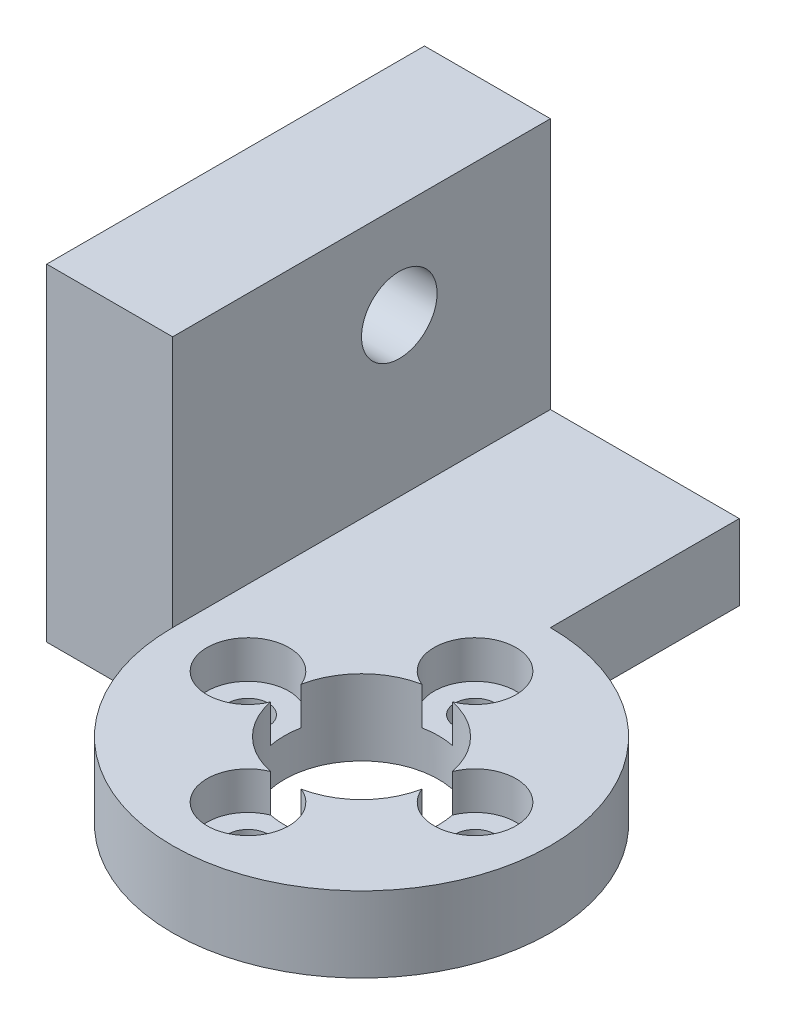
ISO-10303-21;
HEADER;
FILE_DESCRIPTION(('STEP AP214'),'2;1');
FILE_NAME('part.step','',(''),(''),'','','');
FILE_SCHEMA(('AUTOMOTIVE_DESIGN { 1 0 10303 214 1 1 1 1 }'));
ENDSEC;
DATA;
#1=APPLICATION_CONTEXT('core data for automotive mechanical design processes');
#2=APPLICATION_PROTOCOL_DEFINITION('international standard','automotive_design',2000,#1);
#3=PRODUCT_CONTEXT('',#1,'mechanical');
#4=PRODUCT('Part','Part','',(#3));
#5=PRODUCT_RELATED_PRODUCT_CATEGORY('part','',(#4));
#6=PRODUCT_DEFINITION_FORMATION('','',#4);
#7=PRODUCT_DEFINITION_CONTEXT('part definition',#1,'design');
#8=PRODUCT_DEFINITION('design','',#6,#7);
#9=PRODUCT_DEFINITION_SHAPE('','',#8);
#10=(LENGTH_UNIT() NAMED_UNIT(*) SI_UNIT(.MILLI.,.METRE.));
#11=(NAMED_UNIT(*) PLANE_ANGLE_UNIT() SI_UNIT($,.RADIAN.));
#12=(NAMED_UNIT(*) SI_UNIT($,.STERADIAN.) SOLID_ANGLE_UNIT());
#13=UNCERTAINTY_MEASURE_WITH_UNIT(LENGTH_MEASURE(1.E-05),#10,'distance_accuracy_value','');
#14=(GEOMETRIC_REPRESENTATION_CONTEXT(3) GLOBAL_UNCERTAINTY_ASSIGNED_CONTEXT((#13)) GLOBAL_UNIT_ASSIGNED_CONTEXT((#10,
#11,#12)) REPRESENTATION_CONTEXT('',''));
#15=CARTESIAN_POINT('',(0.,0.,0.));
#16=DIRECTION('',(0.,0.,1.));
#17=DIRECTION('',(1.,0.,0.));
#18=AXIS2_PLACEMENT_3D('',#15,#16,#17);
#19=CARTESIAN_POINT('',(0.,6.,0.));
#20=DIRECTION('',(0.,-1.,0.));
#21=DIRECTION('',(0.,0.,-1.));
#22=AXIS2_PLACEMENT_3D('',#19,#20,#21);
#23=CYLINDRICAL_SURFACE('',#22,15.);
#24=DIRECTION('',(0.,-1.,0.));
#25=VECTOR('',#24,1.);
#26=CARTESIAN_POINT('',(-15.,26.,0.));
#27=LINE('',#26,#25);
#28=CARTESIAN_POINT('',(-15.,6.,0.));
#29=VERTEX_POINT('',#28);
#30=CARTESIAN_POINT('',(-15.,0.,0.));
#31=VERTEX_POINT('',#30);
#32=EDGE_CURVE('E194',#29,#31,#27,.T.);
#33=ORIENTED_EDGE('',*,*,#32,.T.);
#34=CARTESIAN_POINT('',(0.,0.,0.));
#35=DIRECTION('',(0.,1.,0.));
#36=DIRECTION('',(0.,0.,1.));
#37=AXIS2_PLACEMENT_3D('',#34,#35,#36);
#38=CIRCLE('',#37,15.);
#39=CARTESIAN_POINT('',(0.,0.,-15.));
#40=VERTEX_POINT('',#39);
#41=EDGE_CURVE('E49',#31,#40,#38,.T.);
#42=ORIENTED_EDGE('',*,*,#41,.T.);
#43=DIRECTION('',(0.,-1.,0.));
#44=VECTOR('',#43,1.);
#45=CARTESIAN_POINT('',(0.,26.,-15.));
#46=LINE('',#45,#44);
#47=CARTESIAN_POINT('',(0.,6.,-15.));
#48=VERTEX_POINT('',#47);
#49=EDGE_CURVE('E192',#48,#40,#46,.T.);
#50=ORIENTED_EDGE('',*,*,#49,.F.);
#51=CARTESIAN_POINT('',(0.,6.,0.));
#52=DIRECTION('',(0.,1.,0.));
#53=DIRECTION('',(0.,0.,1.));
#54=AXIS2_PLACEMENT_3D('',#51,#52,#53);
#55=CIRCLE('',#54,15.);
#56=EDGE_CURVE('E246',#29,#48,#55,.T.);
#57=ORIENTED_EDGE('',*,*,#56,.F.);
#58=EDGE_LOOP('',(#33,#42,#50,#57));
#59=FACE_BOUND('',#58,.T.);
#60=ADVANCED_FACE('F35',(#59),#23,.T.);
#61=CARTESIAN_POINT('',(0.,6.,0.));
#62=DIRECTION('',(0.,1.,0.));
#63=DIRECTION('',(0.,0.,1.));
#64=AXIS2_PLACEMENT_3D('',#61,#62,#63);
#65=PLANE('',#64);
#66=CARTESIAN_POINT('',(9.017,6.,0.));
#67=DIRECTION('',(0.,1.,0.));
#68=DIRECTION('',(0.,0.,1.));
#69=AXIS2_PLACEMENT_3D('',#66,#67,#68);
#70=CIRCLE('',#69,3.25);
#71=CARTESIAN_POINT('',(6.00307275146946,6.,1.21603558359322));
#72=VERTEX_POINT('',#71);
#73=CARTESIAN_POINT('',(6.00307275146943,6.,-1.21603558359334));
#74=VERTEX_POINT('',#73);
#75=EDGE_CURVE('E197',#72,#74,#70,.T.);
#76=ORIENTED_EDGE('',*,*,#75,.F.);
#77=CARTESIAN_POINT('',(0.,6.,0.));
#78=DIRECTION('',(0.,1.,0.));
#79=DIRECTION('',(0.,0.,1.));
#80=AXIS2_PLACEMENT_3D('',#77,#78,#79);
#81=CIRCLE('',#80,6.125);
#82=CARTESIAN_POINT('',(1.21603558359328,6.,6.00307275146945));
#83=VERTEX_POINT('',#82);
#84=EDGE_CURVE('E285',#83,#72,#81,.T.);
#85=ORIENTED_EDGE('',*,*,#84,.F.);
#86=CARTESIAN_POINT('',(0.,6.,9.017));
#87=DIRECTION('',(0.,1.,0.));
#88=DIRECTION('',(0.,0.,1.));
#89=AXIS2_PLACEMENT_3D('',#86,#87,#88);
#90=CIRCLE('',#89,3.25);
#91=CARTESIAN_POINT('',(-1.21603558359328,6.,6.00307275146945));
#92=VERTEX_POINT('',#91);
#93=EDGE_CURVE('E206',#92,#83,#90,.T.);
#94=ORIENTED_EDGE('',*,*,#93,.F.);
#95=CARTESIAN_POINT('',(-6.00307275146944,6.,1.2160355835933));
#96=VERTEX_POINT('',#95);
#97=EDGE_CURVE('E243',#96,#92,#81,.T.);
#98=ORIENTED_EDGE('',*,*,#97,.F.);
#99=CARTESIAN_POINT('',(-9.017,6.,0.));
#100=DIRECTION('',(0.,1.,0.));
#101=DIRECTION('',(0.,0.,1.));
#102=AXIS2_PLACEMENT_3D('',#99,#100,#101);
#103=CIRCLE('',#102,3.25);
#104=CARTESIAN_POINT('',(-6.00307275146945,6.,-1.21603558359326));
#105=VERTEX_POINT('',#104);
#106=EDGE_CURVE('E216',#105,#96,#103,.T.);
#107=ORIENTED_EDGE('',*,*,#106,.F.);
#108=CARTESIAN_POINT('',(-1.21603558359328,6.,-6.00307275146945));
#109=VERTEX_POINT('',#108);
#110=EDGE_CURVE('E239',#109,#105,#81,.T.);
#111=ORIENTED_EDGE('',*,*,#110,.F.);
#112=CARTESIAN_POINT('',(0.,6.,-9.017));
#113=DIRECTION('',(0.,1.,0.));
#114=DIRECTION('',(0.,0.,1.));
#115=AXIS2_PLACEMENT_3D('',#112,#113,#114);
#116=CIRCLE('',#115,3.25);
#117=CARTESIAN_POINT('',(1.21603558359328,6.,-6.00307275146945));
#118=VERTEX_POINT('',#117);
#119=EDGE_CURVE('E227',#118,#109,#116,.T.);
#120=ORIENTED_EDGE('',*,*,#119,.F.);
#121=EDGE_CURVE('E238',#74,#118,#81,.T.);
#122=ORIENTED_EDGE('',*,*,#121,.F.);
#123=EDGE_LOOP('',(#76,#85,#94,#98,#107,#111,#120,#122));
#124=FACE_BOUND('',#123,.T.);
#125=ORIENTED_EDGE('',*,*,#56,.T.);
#126=DIRECTION('',(0.,0.,1.));
#127=VECTOR('',#126,1.);
#128=CARTESIAN_POINT('',(0.,6.,-30.));
#129=LINE('',#128,#127);
#130=CARTESIAN_POINT('',(0.,6.,-30.));
#131=VERTEX_POINT('',#130);
#132=EDGE_CURVE('E148',#131,#48,#129,.T.);
#133=ORIENTED_EDGE('',*,*,#132,.F.);
#134=DIRECTION('',(1.,0.,0.));
#135=VECTOR('',#134,1.);
#136=CARTESIAN_POINT('',(-15.,6.,-30.));
#137=LINE('',#136,#135);
#138=CARTESIAN_POINT('',(-15.,6.,-30.));
#139=VERTEX_POINT('',#138);
#140=EDGE_CURVE('E156',#139,#131,#137,.T.);
#141=ORIENTED_EDGE('',*,*,#140,.F.);
#142=DIRECTION('',(0.,0.,1.));
#143=VECTOR('',#142,1.);
#144=CARTESIAN_POINT('',(-15.,6.,-15.));
#145=LINE('',#144,#143);
#146=EDGE_CURVE('E147',#139,#29,#145,.T.);
#147=ORIENTED_EDGE('',*,*,#146,.T.);
#148=EDGE_LOOP('',(#125,#133,#141,#147));
#149=FACE_BOUND('',#148,.T.);
#150=ADVANCED_FACE('F291',(#124,#149),#65,.T.);
#151=CARTESIAN_POINT('',(0.,0.,0.));
#152=DIRECTION('',(0.,1.,0.));
#153=DIRECTION('',(0.,0.,1.));
#154=AXIS2_PLACEMENT_3D('',#151,#152,#153);
#155=PLANE('',#154);
#156=CARTESIAN_POINT('',(9.017,0.,0.));
#157=DIRECTION('',(0.,1.,0.));
#158=DIRECTION('',(0.,0.,1.));
#159=AXIS2_PLACEMENT_3D('',#156,#157,#158);
#160=CIRCLE('',#159,1.6);
#161=CARTESIAN_POINT('',(9.017,0.,1.5999999999999));
#162=VERTEX_POINT('',#161);
#163=EDGE_CURVE('E203',#162,#162,#160,.T.);
#164=ORIENTED_EDGE('',*,*,#163,.T.);
#165=EDGE_LOOP('',(#164));
#166=FACE_BOUND('',#165,.T.);
#167=CARTESIAN_POINT('',(0.,0.,9.017));
#168=DIRECTION('',(0.,1.,0.));
#169=DIRECTION('',(0.,0.,1.));
#170=AXIS2_PLACEMENT_3D('',#167,#168,#169);
#171=CIRCLE('',#170,1.6);
#172=CARTESIAN_POINT('',(0.,0.,10.617));
#173=VERTEX_POINT('',#172);
#174=EDGE_CURVE('E213',#173,#173,#171,.T.);
#175=ORIENTED_EDGE('',*,*,#174,.T.);
#176=EDGE_LOOP('',(#175));
#177=FACE_BOUND('',#176,.T.);
#178=CARTESIAN_POINT('',(-9.017,0.,0.));
#179=DIRECTION('',(0.,1.,0.));
#180=DIRECTION('',(0.,0.,1.));
#181=AXIS2_PLACEMENT_3D('',#178,#179,#180);
#182=CIRCLE('',#181,1.6);
#183=CARTESIAN_POINT('',(-9.017,0.,1.60000000000003));
#184=VERTEX_POINT('',#183);
#185=EDGE_CURVE('E224',#184,#184,#182,.T.);
#186=ORIENTED_EDGE('',*,*,#185,.T.);
#187=EDGE_LOOP('',(#186));
#188=FACE_BOUND('',#187,.T.);
#189=CARTESIAN_POINT('',(0.,0.,-9.017));
#190=DIRECTION('',(0.,1.,0.));
#191=DIRECTION('',(0.,0.,1.));
#192=AXIS2_PLACEMENT_3D('',#189,#190,#191);
#193=CIRCLE('',#192,1.6);
#194=CARTESIAN_POINT('',(0.,0.,-7.417));
#195=VERTEX_POINT('',#194);
#196=EDGE_CURVE('E235',#195,#195,#193,.T.);
#197=ORIENTED_EDGE('',*,*,#196,.T.);
#198=EDGE_LOOP('',(#197));
#199=FACE_BOUND('',#198,.T.);
#200=CARTESIAN_POINT('',(0.,0.,0.));
#201=DIRECTION('',(0.,1.,0.));
#202=DIRECTION('',(0.,0.,1.));
#203=AXIS2_PLACEMENT_3D('',#200,#201,#202);
#204=CIRCLE('',#203,6.125);
#205=CARTESIAN_POINT('',(0.,0.,6.125));
#206=VERTEX_POINT('',#205);
#207=EDGE_CURVE('E242',#206,#206,#204,.F.);
#208=ORIENTED_EDGE('',*,*,#207,.F.);
#209=EDGE_LOOP('',(#208));
#210=FACE_BOUND('',#209,.T.);
#211=ORIENTED_EDGE('',*,*,#41,.F.);
#212=DIRECTION('',(-1.,0.,0.));
#213=VECTOR('',#212,1.);
#214=CARTESIAN_POINT('',(-25.,0.,0.));
#215=LINE('',#214,#213);
#216=CARTESIAN_POINT('',(-25.,0.,0.));
#217=VERTEX_POINT('',#216);
#218=EDGE_CURVE('E184',#31,#217,#215,.T.);
#219=ORIENTED_EDGE('',*,*,#218,.T.);
#220=DIRECTION('',(0.,0.,-1.));
#221=VECTOR('',#220,1.);
#222=CARTESIAN_POINT('',(-25.,0.,0.));
#223=LINE('',#222,#221);
#224=CARTESIAN_POINT('',(-25.,0.,-30.));
#225=VERTEX_POINT('',#224);
#226=EDGE_CURVE('E182',#217,#225,#223,.T.);
#227=ORIENTED_EDGE('',*,*,#226,.T.);
#228=DIRECTION('',(-1.,0.,0.));
#229=VECTOR('',#228,1.);
#230=CARTESIAN_POINT('',(0.,0.,-30.));
#231=LINE('',#230,#229);
#232=CARTESIAN_POINT('',(0.,0.,-30.));
#233=VERTEX_POINT('',#232);
#234=EDGE_CURVE('E173',#233,#225,#231,.T.);
#235=ORIENTED_EDGE('',*,*,#234,.F.);
#236=DIRECTION('',(0.,0.,1.));
#237=VECTOR('',#236,1.);
#238=CARTESIAN_POINT('',(0.,0.,-30.));
#239=LINE('',#238,#237);
#240=EDGE_CURVE('E176',#233,#40,#239,.T.);
#241=ORIENTED_EDGE('',*,*,#240,.T.);
#242=EDGE_LOOP('',(#211,#219,#227,#235,#241));
#243=FACE_BOUND('',#242,.T.);
#244=ADVANCED_FACE('F323',(#166,#177,#188,#199,#210,#243),#155,.F.);
#245=CARTESIAN_POINT('',(0.,-0.00100000000000013,0.));
#246=DIRECTION('',(0.,1.,0.));
#247=DIRECTION('',(0.,0.,1.));
#248=AXIS2_PLACEMENT_3D('',#245,#246,#247);
#249=CYLINDRICAL_SURFACE('',#248,6.125);
#250=CARTESIAN_POINT('',(0.,3.,0.));
#251=DIRECTION('',(0.,-1.,0.));
#252=DIRECTION('',(0.,0.,-1.));
#253=AXIS2_PLACEMENT_3D('',#250,#251,#252);
#254=CIRCLE('',#253,6.125);
#255=CARTESIAN_POINT('',(6.00307275146946,3.,1.21603558359322));
#256=VERTEX_POINT('',#255);
#257=CARTESIAN_POINT('',(6.00307275146943,3.,-1.21603558359334));
#258=VERTEX_POINT('',#257);
#259=EDGE_CURVE('E277',#256,#258,#254,.F.);
#260=ORIENTED_EDGE('',*,*,#259,.T.);
#261=DIRECTION('',(0.,1.,0.));
#262=VECTOR('',#261,1.);
#263=CARTESIAN_POINT('',(6.00307275146943,4.5,-1.21603558359334));
#264=LINE('',#263,#262);
#265=EDGE_CURVE('E11',#258,#74,#264,.T.);
#266=ORIENTED_EDGE('',*,*,#265,.T.);
#267=ORIENTED_EDGE('',*,*,#121,.T.);
#268=DIRECTION('',(0.,1.,0.));
#269=VECTOR('',#268,1.);
#270=CARTESIAN_POINT('',(1.21603558359328,4.5,-6.00307275146945));
#271=LINE('',#270,#269);
#272=CARTESIAN_POINT('',(1.21603558359328,3.,-6.00307275146945));
#273=VERTEX_POINT('',#272);
#274=EDGE_CURVE('E249',#118,#273,#271,.F.);
#275=ORIENTED_EDGE('',*,*,#274,.T.);
#276=CARTESIAN_POINT('',(0.,3.,0.));
#277=DIRECTION('',(0.,-1.,0.));
#278=DIRECTION('',(0.,0.,-1.));
#279=AXIS2_PLACEMENT_3D('',#276,#277,#278);
#280=CIRCLE('',#279,6.125);
#281=CARTESIAN_POINT('',(-1.21603558359328,3.,-6.00307275146945));
#282=VERTEX_POINT('',#281);
#283=EDGE_CURVE('E253',#273,#282,#280,.F.);
#284=ORIENTED_EDGE('',*,*,#283,.T.);
#285=DIRECTION('',(0.,1.,0.));
#286=VECTOR('',#285,1.);
#287=CARTESIAN_POINT('',(-1.21603558359328,4.5,-6.00307275146945));
#288=LINE('',#287,#286);
#289=EDGE_CURVE('E256',#282,#109,#288,.T.);
#290=ORIENTED_EDGE('',*,*,#289,.T.);
#291=ORIENTED_EDGE('',*,*,#110,.T.);
#292=DIRECTION('',(0.,1.,0.));
#293=VECTOR('',#292,1.);
#294=CARTESIAN_POINT('',(-6.00307275146945,4.5,-1.21603558359326));
#295=LINE('',#294,#293);
#296=CARTESIAN_POINT('',(-6.00307275146945,3.,-1.21603558359326));
#297=VERTEX_POINT('',#296);
#298=EDGE_CURVE('E259',#105,#297,#295,.F.);
#299=ORIENTED_EDGE('',*,*,#298,.T.);
#300=CARTESIAN_POINT('',(0.,3.,0.));
#301=DIRECTION('',(0.,-1.,0.));
#302=DIRECTION('',(0.,0.,-1.));
#303=AXIS2_PLACEMENT_3D('',#300,#301,#302);
#304=CIRCLE('',#303,6.125);
#305=CARTESIAN_POINT('',(-6.00307275146944,3.,1.2160355835933));
#306=VERTEX_POINT('',#305);
#307=EDGE_CURVE('E262',#297,#306,#304,.F.);
#308=ORIENTED_EDGE('',*,*,#307,.T.);
#309=DIRECTION('',(0.,1.,0.));
#310=VECTOR('',#309,1.);
#311=CARTESIAN_POINT('',(-6.00307275146944,4.5,1.2160355835933));
#312=LINE('',#311,#310);
#313=EDGE_CURVE('E265',#306,#96,#312,.T.);
#314=ORIENTED_EDGE('',*,*,#313,.T.);
#315=ORIENTED_EDGE('',*,*,#97,.T.);
#316=DIRECTION('',(0.,1.,0.));
#317=VECTOR('',#316,1.);
#318=CARTESIAN_POINT('',(-1.21603558359328,4.5,6.00307275146945));
#319=LINE('',#318,#317);
#320=CARTESIAN_POINT('',(-1.21603558359328,3.,6.00307275146945));
#321=VERTEX_POINT('',#320);
#322=EDGE_CURVE('E271',#92,#321,#319,.F.);
#323=ORIENTED_EDGE('',*,*,#322,.T.);
#324=CARTESIAN_POINT('',(0.,3.,0.));
#325=DIRECTION('',(0.,-1.,0.));
#326=DIRECTION('',(0.,0.,-1.));
#327=AXIS2_PLACEMENT_3D('',#324,#325,#326);
#328=CIRCLE('',#327,6.125);
#329=CARTESIAN_POINT('',(1.21603558359328,3.,6.00307275146945));
#330=VERTEX_POINT('',#329);
#331=EDGE_CURVE('E268',#321,#330,#328,.F.);
#332=ORIENTED_EDGE('',*,*,#331,.T.);
#333=DIRECTION('',(0.,1.,0.));
#334=VECTOR('',#333,1.);
#335=CARTESIAN_POINT('',(1.21603558359328,4.5,6.00307275146945));
#336=LINE('',#335,#334);
#337=EDGE_CURVE('E274',#330,#83,#336,.T.);
#338=ORIENTED_EDGE('',*,*,#337,.T.);
#339=ORIENTED_EDGE('',*,*,#84,.T.);
#340=DIRECTION('',(0.,1.,0.));
#341=VECTOR('',#340,1.);
#342=CARTESIAN_POINT('',(6.00307275146946,4.5,1.21603558359322));
#343=LINE('',#342,#341);
#344=EDGE_CURVE('E42',#72,#256,#343,.F.);
#345=ORIENTED_EDGE('',*,*,#344,.T.);
#346=EDGE_LOOP('',(#260,#266,#267,#275,#284,#290,#291,#299,#308,#314,#315,#323,#332,#338,#339,#345));
#347=FACE_BOUND('',#346,.T.);
#348=ORIENTED_EDGE('',*,*,#207,.T.);
#349=EDGE_LOOP('',(#348));
#350=FACE_BOUND('',#349,.T.);
#351=ADVANCED_FACE('F282',(#347,#350),#249,.F.);
#352=CARTESIAN_POINT('',(1.6,3.,-9.017));
#353=DIRECTION('',(0.,-1.,0.));
#354=DIRECTION('',(0.,0.,-1.));
#355=AXIS2_PLACEMENT_3D('',#352,#353,#354);
#356=PLANE('',#355);
#357=CARTESIAN_POINT('',(0.,3.,-9.017));
#358=DIRECTION('',(0.,1.,0.));
#359=DIRECTION('',(0.,0.,1.));
#360=AXIS2_PLACEMENT_3D('',#357,#358,#359);
#361=CIRCLE('',#360,1.6);
#362=CARTESIAN_POINT('',(0.,3.,-7.417));
#363=VERTEX_POINT('',#362);
#364=EDGE_CURVE('E232',#363,#363,#361,.T.);
#365=ORIENTED_EDGE('',*,*,#364,.F.);
#366=EDGE_LOOP('',(#365));
#367=FACE_BOUND('',#366,.T.);
#368=CARTESIAN_POINT('',(0.,3.,-9.017));
#369=DIRECTION('',(0.,1.,0.));
#370=DIRECTION('',(0.,0.,1.));
#371=AXIS2_PLACEMENT_3D('',#368,#369,#370);
#372=CIRCLE('',#371,3.25);
#373=EDGE_CURVE('E229',#273,#282,#372,.T.);
#374=ORIENTED_EDGE('',*,*,#373,.T.);
#375=ORIENTED_EDGE('',*,*,#283,.F.);
#376=EDGE_LOOP('',(#374,#375));
#377=FACE_BOUND('',#376,.T.);
#378=ADVANCED_FACE('F385',(#367,#377),#356,.F.);
#379=CARTESIAN_POINT('',(0.,6.,-9.017));
#380=DIRECTION('',(0.,1.,0.));
#381=DIRECTION('',(0.,0.,1.));
#382=AXIS2_PLACEMENT_3D('',#379,#380,#381);
#383=CYLINDRICAL_SURFACE('',#382,3.25);
#384=ORIENTED_EDGE('',*,*,#373,.F.);
#385=ORIENTED_EDGE('',*,*,#274,.F.);
#386=ORIENTED_EDGE('',*,*,#119,.T.);
#387=ORIENTED_EDGE('',*,*,#289,.F.);
#388=EDGE_LOOP('',(#384,#385,#386,#387));
#389=FACE_BOUND('',#388,.T.);
#390=ADVANCED_FACE('F390',(#389),#383,.F.);
#391=CARTESIAN_POINT('',(0.,6.,-9.017));
#392=DIRECTION('',(0.,1.,0.));
#393=DIRECTION('',(0.,0.,1.));
#394=AXIS2_PLACEMENT_3D('',#391,#392,#393);
#395=CYLINDRICAL_SURFACE('',#394,1.6);
#396=ORIENTED_EDGE('',*,*,#196,.F.);
#397=EDGE_LOOP('',(#396));
#398=FACE_BOUND('',#397,.T.);
#399=ORIENTED_EDGE('',*,*,#364,.T.);
#400=EDGE_LOOP('',(#399));
#401=FACE_BOUND('',#400,.T.);
#402=ADVANCED_FACE('F394',(#398,#401),#395,.F.);
#403=CARTESIAN_POINT('',(-7.417,3.,0.));
#404=DIRECTION('',(0.,-1.,0.));
#405=DIRECTION('',(0.,0.,-1.));
#406=AXIS2_PLACEMENT_3D('',#403,#404,#405);
#407=PLANE('',#406);
#408=CARTESIAN_POINT('',(-9.017,3.,0.));
#409=DIRECTION('',(0.,1.,0.));
#410=DIRECTION('',(0.,0.,1.));
#411=AXIS2_PLACEMENT_3D('',#408,#409,#410);
#412=CIRCLE('',#411,1.6);
#413=CARTESIAN_POINT('',(-9.017,3.,1.60000000000003));
#414=VERTEX_POINT('',#413);
#415=EDGE_CURVE('E221',#414,#414,#412,.T.);
#416=ORIENTED_EDGE('',*,*,#415,.F.);
#417=EDGE_LOOP('',(#416));
#418=FACE_BOUND('',#417,.T.);
#419=CARTESIAN_POINT('',(-9.017,3.,0.));
#420=DIRECTION('',(0.,1.,0.));
#421=DIRECTION('',(0.,0.,1.));
#422=AXIS2_PLACEMENT_3D('',#419,#420,#421);
#423=CIRCLE('',#422,3.25);
#424=EDGE_CURVE('E218',#297,#306,#423,.T.);
#425=ORIENTED_EDGE('',*,*,#424,.T.);
#426=ORIENTED_EDGE('',*,*,#307,.F.);
#427=EDGE_LOOP('',(#425,#426));
#428=FACE_BOUND('',#427,.T.);
#429=ADVANCED_FACE('F396',(#418,#428),#407,.F.);
#430=CARTESIAN_POINT('',(-9.017,6.,0.));
#431=DIRECTION('',(0.,1.,0.));
#432=DIRECTION('',(0.,0.,1.));
#433=AXIS2_PLACEMENT_3D('',#430,#431,#432);
#434=CYLINDRICAL_SURFACE('',#433,3.25);
#435=ORIENTED_EDGE('',*,*,#424,.F.);
#436=ORIENTED_EDGE('',*,*,#298,.F.);
#437=ORIENTED_EDGE('',*,*,#106,.T.);
#438=ORIENTED_EDGE('',*,*,#313,.F.);
#439=EDGE_LOOP('',(#435,#436,#437,#438));
#440=FACE_BOUND('',#439,.T.);
#441=ADVANCED_FACE('F404',(#440),#434,.F.);
#442=CARTESIAN_POINT('',(-9.017,6.,0.));
#443=DIRECTION('',(0.,1.,0.));
#444=DIRECTION('',(0.,0.,1.));
#445=AXIS2_PLACEMENT_3D('',#442,#443,#444);
#446=CYLINDRICAL_SURFACE('',#445,1.6);
#447=ORIENTED_EDGE('',*,*,#185,.F.);
#448=EDGE_LOOP('',(#447));
#449=FACE_BOUND('',#448,.T.);
#450=ORIENTED_EDGE('',*,*,#415,.T.);
#451=EDGE_LOOP('',(#450));
#452=FACE_BOUND('',#451,.T.);
#453=ADVANCED_FACE('F316',(#449,#452),#446,.F.);
#454=CARTESIAN_POINT('',(0.,6.,9.017));
#455=DIRECTION('',(0.,1.,0.));
#456=DIRECTION('',(0.,0.,1.));
#457=AXIS2_PLACEMENT_3D('',#454,#455,#456);
#458=CYLINDRICAL_SURFACE('',#457,3.25);
#459=CARTESIAN_POINT('',(0.,3.,9.017));
#460=DIRECTION('',(0.,1.,0.));
#461=DIRECTION('',(0.,0.,1.));
#462=AXIS2_PLACEMENT_3D('',#459,#460,#461);
#463=CIRCLE('',#462,3.25);
#464=EDGE_CURVE('E208',#321,#330,#463,.T.);
#465=ORIENTED_EDGE('',*,*,#464,.F.);
#466=ORIENTED_EDGE('',*,*,#322,.F.);
#467=ORIENTED_EDGE('',*,*,#93,.T.);
#468=ORIENTED_EDGE('',*,*,#337,.F.);
#469=EDGE_LOOP('',(#465,#466,#467,#468));
#470=FACE_BOUND('',#469,.T.);
#471=ADVANCED_FACE('F303',(#470),#458,.F.);
#472=CARTESIAN_POINT('',(1.6,3.,9.017));
#473=DIRECTION('',(0.,-1.,0.));
#474=DIRECTION('',(0.,0.,-1.));
#475=AXIS2_PLACEMENT_3D('',#472,#473,#474);
#476=PLANE('',#475);
#477=CARTESIAN_POINT('',(0.,3.,9.017));
#478=DIRECTION('',(0.,1.,0.));
#479=DIRECTION('',(0.,0.,1.));
#480=AXIS2_PLACEMENT_3D('',#477,#478,#479);
#481=CIRCLE('',#480,1.6);
#482=CARTESIAN_POINT('',(0.,3.,10.617));
#483=VERTEX_POINT('',#482);
#484=EDGE_CURVE('E210',#483,#483,#481,.T.);
#485=ORIENTED_EDGE('',*,*,#484,.F.);
#486=EDGE_LOOP('',(#485));
#487=FACE_BOUND('',#486,.T.);
#488=ORIENTED_EDGE('',*,*,#464,.T.);
#489=ORIENTED_EDGE('',*,*,#331,.F.);
#490=EDGE_LOOP('',(#488,#489));
#491=FACE_BOUND('',#490,.T.);
#492=ADVANCED_FACE('F305',(#487,#491),#476,.F.);
#493=CARTESIAN_POINT('',(0.,6.,9.017));
#494=DIRECTION('',(0.,1.,0.));
#495=DIRECTION('',(0.,0.,1.));
#496=AXIS2_PLACEMENT_3D('',#493,#494,#495);
#497=CYLINDRICAL_SURFACE('',#496,1.6);
#498=ORIENTED_EDGE('',*,*,#174,.F.);
#499=EDGE_LOOP('',(#498));
#500=FACE_BOUND('',#499,.T.);
#501=ORIENTED_EDGE('',*,*,#484,.T.);
#502=EDGE_LOOP('',(#501));
#503=FACE_BOUND('',#502,.T.);
#504=ADVANCED_FACE('F307',(#500,#503),#497,.F.);
#505=CARTESIAN_POINT('',(9.017,6.,0.));
#506=DIRECTION('',(0.,1.,0.));
#507=DIRECTION('',(0.,0.,1.));
#508=AXIS2_PLACEMENT_3D('',#505,#506,#507);
#509=CYLINDRICAL_SURFACE('',#508,3.25);
#510=CARTESIAN_POINT('',(9.017,3.,0.));
#511=DIRECTION('',(0.,1.,0.));
#512=DIRECTION('',(0.,0.,1.));
#513=AXIS2_PLACEMENT_3D('',#510,#511,#512);
#514=CIRCLE('',#513,3.25);
#515=EDGE_CURVE('E56',#256,#258,#514,.T.);
#516=ORIENTED_EDGE('',*,*,#515,.F.);
#517=ORIENTED_EDGE('',*,*,#344,.F.);
#518=ORIENTED_EDGE('',*,*,#75,.T.);
#519=ORIENTED_EDGE('',*,*,#265,.F.);
#520=EDGE_LOOP('',(#516,#517,#518,#519));
#521=FACE_BOUND('',#520,.T.);
#522=ADVANCED_FACE('F288',(#521),#509,.F.);
#523=CARTESIAN_POINT('',(10.617,3.,0.));
#524=DIRECTION('',(0.,-1.,0.));
#525=DIRECTION('',(0.,0.,-1.));
#526=AXIS2_PLACEMENT_3D('',#523,#524,#525);
#527=PLANE('',#526);
#528=CARTESIAN_POINT('',(9.017,3.,0.));
#529=DIRECTION('',(0.,1.,0.));
#530=DIRECTION('',(0.,0.,1.));
#531=AXIS2_PLACEMENT_3D('',#528,#529,#530);
#532=CIRCLE('',#531,1.6);
#533=CARTESIAN_POINT('',(9.017,3.,1.5999999999999));
#534=VERTEX_POINT('',#533);
#535=EDGE_CURVE('E200',#534,#534,#532,.T.);
#536=ORIENTED_EDGE('',*,*,#535,.F.);
#537=EDGE_LOOP('',(#536));
#538=FACE_BOUND('',#537,.T.);
#539=ORIENTED_EDGE('',*,*,#515,.T.);
#540=ORIENTED_EDGE('',*,*,#259,.F.);
#541=EDGE_LOOP('',(#539,#540));
#542=FACE_BOUND('',#541,.T.);
#543=ADVANCED_FACE('F363',(#538,#542),#527,.F.);
#544=CARTESIAN_POINT('',(9.017,6.,0.));
#545=DIRECTION('',(0.,1.,0.));
#546=DIRECTION('',(0.,0.,1.));
#547=AXIS2_PLACEMENT_3D('',#544,#545,#546);
#548=CYLINDRICAL_SURFACE('',#547,1.6);
#549=ORIENTED_EDGE('',*,*,#163,.F.);
#550=EDGE_LOOP('',(#549));
#551=FACE_BOUND('',#550,.T.);
#552=ORIENTED_EDGE('',*,*,#535,.T.);
#553=EDGE_LOOP('',(#552));
#554=FACE_BOUND('',#553,.T.);
#555=ADVANCED_FACE('F360',(#551,#554),#548,.F.);
#556=CARTESIAN_POINT('',(-25.,26.,0.));
#557=DIRECTION('',(0.,0.,-1.));
#558=DIRECTION('',(-1.,0.,0.));
#559=AXIS2_PLACEMENT_3D('',#556,#557,#558);
#560=PLANE('',#559);
#561=DIRECTION('',(0.,-1.,0.));
#562=VECTOR('',#561,1.);
#563=CARTESIAN_POINT('',(-25.,26.,0.));
#564=LINE('',#563,#562);
#565=CARTESIAN_POINT('',(-25.,26.,0.));
#566=VERTEX_POINT('',#565);
#567=EDGE_CURVE('E190',#566,#217,#564,.T.);
#568=ORIENTED_EDGE('',*,*,#567,.T.);
#569=ORIENTED_EDGE('',*,*,#218,.F.);
#570=ORIENTED_EDGE('',*,*,#32,.F.);
#571=CARTESIAN_POINT('',(-15.,26.,0.));
#572=VERTEX_POINT('',#571);
#573=EDGE_CURVE('E195',#572,#29,#27,.T.);
#574=ORIENTED_EDGE('',*,*,#573,.F.);
#575=DIRECTION('',(1.,0.,0.));
#576=VECTOR('',#575,1.);
#577=CARTESIAN_POINT('',(-25.,26.,0.));
#578=LINE('',#577,#576);
#579=EDGE_CURVE('E144',#566,#572,#578,.T.);
#580=ORIENTED_EDGE('',*,*,#579,.F.);
#581=EDGE_LOOP('',(#568,#569,#570,#574,#580));
#582=FACE_BOUND('',#581,.T.);
#583=ADVANCED_FACE('F329',(#582),#560,.F.);
#584=CARTESIAN_POINT('',(-25.,26.,0.));
#585=DIRECTION('',(1.,0.,0.));
#586=DIRECTION('',(0.,0.,-1.));
#587=AXIS2_PLACEMENT_3D('',#584,#585,#586);
#588=PLANE('',#587);
#589=CARTESIAN_POINT('',(-25.,18.5,-18.));
#590=DIRECTION('',(1.,0.,0.));
#591=DIRECTION('',(0.,0.,-1.));
#592=AXIS2_PLACEMENT_3D('',#589,#590,#591);
#593=CIRCLE('',#592,3.);
#594=CARTESIAN_POINT('',(-25.,18.5,-21.));
#595=VERTEX_POINT('',#594);
#596=EDGE_CURVE('E163',#595,#595,#593,.F.);
#597=ORIENTED_EDGE('',*,*,#596,.F.);
#598=EDGE_LOOP('',(#597));
#599=FACE_BOUND('',#598,.T.);
#600=DIRECTION('',(0.,0.,1.));
#601=VECTOR('',#600,1.);
#602=CARTESIAN_POINT('',(-25.,26.,0.));
#603=LINE('',#602,#601);
#604=CARTESIAN_POINT('',(-25.,26.,-30.));
#605=VERTEX_POINT('',#604);
#606=EDGE_CURVE('E188',#605,#566,#603,.T.);
#607=ORIENTED_EDGE('',*,*,#606,.F.);
#608=DIRECTION('',(0.,1.,0.));
#609=VECTOR('',#608,1.);
#610=CARTESIAN_POINT('',(-25.,0.,-30.));
#611=LINE('',#610,#609);
#612=EDGE_CURVE('E162',#225,#605,#611,.T.);
#613=ORIENTED_EDGE('',*,*,#612,.F.);
#614=ORIENTED_EDGE('',*,*,#226,.F.);
#615=ORIENTED_EDGE('',*,*,#567,.F.);
#616=EDGE_LOOP('',(#607,#613,#614,#615));
#617=FACE_BOUND('',#616,.T.);
#618=ADVANCED_FACE('F335',(#599,#617),#588,.F.);
#619=CARTESIAN_POINT('',(0.,26.,0.));
#620=DIRECTION('',(0.,1.,0.));
#621=DIRECTION('',(0.,0.,1.));
#622=AXIS2_PLACEMENT_3D('',#619,#620,#621);
#623=PLANE('',#622);
#624=DIRECTION('',(0.,0.,-1.));
#625=VECTOR('',#624,1.);
#626=CARTESIAN_POINT('',(-15.,26.,0.));
#627=LINE('',#626,#625);
#628=CARTESIAN_POINT('',(-15.,26.,-30.));
#629=VERTEX_POINT('',#628);
#630=EDGE_CURVE('E138',#572,#629,#627,.T.);
#631=ORIENTED_EDGE('',*,*,#630,.T.);
#632=DIRECTION('',(1.,0.,0.));
#633=VECTOR('',#632,1.);
#634=CARTESIAN_POINT('',(-25.,26.,-30.));
#635=LINE('',#634,#633);
#636=EDGE_CURVE('E142',#605,#629,#635,.T.);
#637=ORIENTED_EDGE('',*,*,#636,.F.);
#638=ORIENTED_EDGE('',*,*,#606,.T.);
#639=ORIENTED_EDGE('',*,*,#579,.T.);
#640=EDGE_LOOP('',(#631,#637,#638,#639));
#641=FACE_BOUND('',#640,.T.);
#642=ADVANCED_FACE('F140',(#641),#623,.T.);
#643=CARTESIAN_POINT('',(-15.,0.,0.));
#644=DIRECTION('',(-1.,0.,0.));
#645=DIRECTION('',(0.,0.,1.));
#646=AXIS2_PLACEMENT_3D('',#643,#644,#645);
#647=PLANE('',#646);
#648=CARTESIAN_POINT('',(-15.,18.5,-18.));
#649=DIRECTION('',(1.,0.,0.));
#650=DIRECTION('',(0.,0.,-1.));
#651=AXIS2_PLACEMENT_3D('',#648,#649,#650);
#652=CIRCLE('',#651,3.);
#653=CARTESIAN_POINT('',(-15.,18.5,-21.));
#654=VERTEX_POINT('',#653);
#655=EDGE_CURVE('E166',#654,#654,#652,.T.);
#656=ORIENTED_EDGE('',*,*,#655,.F.);
#657=EDGE_LOOP('',(#656));
#658=FACE_BOUND('',#657,.T.);
#659=ORIENTED_EDGE('',*,*,#573,.T.);
#660=ORIENTED_EDGE('',*,*,#146,.F.);
#661=DIRECTION('',(0.,-1.,0.));
#662=VECTOR('',#661,1.);
#663=CARTESIAN_POINT('',(-15.,26.,-30.));
#664=LINE('',#663,#662);
#665=EDGE_CURVE('E151',#629,#139,#664,.T.);
#666=ORIENTED_EDGE('',*,*,#665,.F.);
#667=ORIENTED_EDGE('',*,*,#630,.F.);
#668=EDGE_LOOP('',(#659,#660,#666,#667));
#669=FACE_BOUND('',#668,.T.);
#670=ADVANCED_FACE('F152',(#658,#669),#647,.F.);
#671=CARTESIAN_POINT('',(0.,6.,-30.));
#672=DIRECTION('',(-1.,0.,0.));
#673=DIRECTION('',(0.,0.,1.));
#674=AXIS2_PLACEMENT_3D('',#671,#672,#673);
#675=PLANE('',#674);
#676=ORIENTED_EDGE('',*,*,#49,.T.);
#677=ORIENTED_EDGE('',*,*,#240,.F.);
#678=DIRECTION('',(0.,-1.,0.));
#679=VECTOR('',#678,1.);
#680=CARTESIAN_POINT('',(0.,6.,-30.));
#681=LINE('',#680,#679);
#682=EDGE_CURVE('E171',#131,#233,#681,.T.);
#683=ORIENTED_EDGE('',*,*,#682,.F.);
#684=ORIENTED_EDGE('',*,*,#132,.T.);
#685=EDGE_LOOP('',(#676,#677,#683,#684));
#686=FACE_BOUND('',#685,.T.);
#687=ADVANCED_FACE('F340',(#686),#675,.F.);
#688=CARTESIAN_POINT('',(0.,0.,-30.));
#689=DIRECTION('',(0.,0.,-1.));
#690=DIRECTION('',(-1.,0.,0.));
#691=AXIS2_PLACEMENT_3D('',#688,#689,#690);
#692=PLANE('',#691);
#693=ORIENTED_EDGE('',*,*,#636,.T.);
#694=ORIENTED_EDGE('',*,*,#665,.T.);
#695=ORIENTED_EDGE('',*,*,#140,.T.);
#696=ORIENTED_EDGE('',*,*,#682,.T.);
#697=ORIENTED_EDGE('',*,*,#234,.T.);
#698=ORIENTED_EDGE('',*,*,#612,.T.);
#699=EDGE_LOOP('',(#693,#694,#695,#696,#697,#698));
#700=FACE_BOUND('',#699,.T.);
#701=ADVANCED_FACE('F159',(#700),#692,.T.);
#702=CARTESIAN_POINT('',(-25.001,18.5,-18.));
#703=DIRECTION('',(1.,0.,0.));
#704=DIRECTION('',(0.,0.,-1.));
#705=AXIS2_PLACEMENT_3D('',#702,#703,#704);
#706=CYLINDRICAL_SURFACE('',#705,3.);
#707=ORIENTED_EDGE('',*,*,#655,.T.);
#708=EDGE_LOOP('',(#707));
#709=FACE_BOUND('',#708,.T.);
#710=ORIENTED_EDGE('',*,*,#596,.T.);
#711=EDGE_LOOP('',(#710));
#712=FACE_BOUND('',#711,.T.);
#713=ADVANCED_FACE('F347',(#709,#712),#706,.F.);
#714=CLOSED_SHELL('',(#60,#150,#244,#351,#378,#390,#402,#429,#441,#453,#471,#492,#504,#522,#543,
#555,#583,#618,#642,#670,#687,#701,#713));
#715=MANIFOLD_SOLID_BREP('B2',#714);
#716=ADVANCED_BREP_SHAPE_REPRESENTATION('',(#18,#715),#14);
#717=SHAPE_DEFINITION_REPRESENTATION(#9,#716);
ENDSEC;
END-ISO-10303-21;
